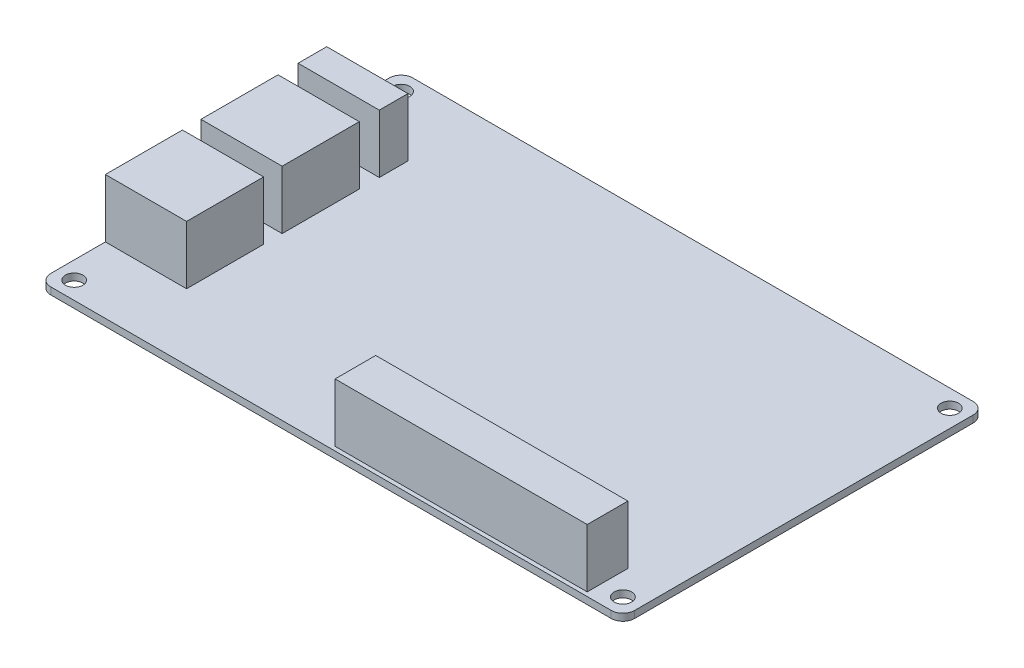
ISO-10303-21;
HEADER;
FILE_DESCRIPTION(('STEP AP214'),'2;1');
FILE_NAME('part.step','',(''),(''),'','','');
FILE_SCHEMA(('AUTOMOTIVE_DESIGN { 1 0 10303 214 1 1 1 1 }'));
ENDSEC;
DATA;
#1=APPLICATION_CONTEXT('core data for automotive mechanical design processes');
#2=APPLICATION_PROTOCOL_DEFINITION('international standard','automotive_design',2000,#1);
#3=PRODUCT_CONTEXT('',#1,'mechanical');
#4=PRODUCT('Part','Part','',(#3));
#5=PRODUCT_RELATED_PRODUCT_CATEGORY('part','',(#4));
#6=PRODUCT_DEFINITION_FORMATION('','',#4);
#7=PRODUCT_DEFINITION_CONTEXT('part definition',#1,'design');
#8=PRODUCT_DEFINITION('design','',#6,#7);
#9=PRODUCT_DEFINITION_SHAPE('','',#8);
#10=(LENGTH_UNIT() NAMED_UNIT(*) SI_UNIT(.MILLI.,.METRE.));
#11=(NAMED_UNIT(*) PLANE_ANGLE_UNIT() SI_UNIT($,.RADIAN.));
#12=(NAMED_UNIT(*) SI_UNIT($,.STERADIAN.) SOLID_ANGLE_UNIT());
#13=UNCERTAINTY_MEASURE_WITH_UNIT(LENGTH_MEASURE(1.E-05),#10,'distance_accuracy_value','');
#14=(GEOMETRIC_REPRESENTATION_CONTEXT(3) GLOBAL_UNCERTAINTY_ASSIGNED_CONTEXT((#13)) GLOBAL_UNIT_ASSIGNED_CONTEXT((#10,
#11,#12)) REPRESENTATION_CONTEXT('',''));
#15=CARTESIAN_POINT('',(0.,0.,0.));
#16=DIRECTION('',(0.,0.,1.));
#17=DIRECTION('',(1.,0.,0.));
#18=AXIS2_PLACEMENT_3D('',#15,#16,#17);
#19=CARTESIAN_POINT('',(-48.,1.2,29.));
#20=DIRECTION('',(0.,-1.,0.));
#21=DIRECTION('',(0.,0.,-1.));
#22=AXIS2_PLACEMENT_3D('',#19,#20,#21);
#23=PLANE('',#22);
#24=DIRECTION('',(1.,0.,0.));
#25=VECTOR('',#24,1.);
#26=CARTESIAN_POINT('',(-50.,1.2,-13.3573164901009));
#27=LINE('',#26,#25);
#28=CARTESIAN_POINT('',(-50.,1.2,-13.3573164901009));
#29=VERTEX_POINT('',#28);
#30=CARTESIAN_POINT('',(-36.0894205408044,1.2,-13.3573164901009));
#31=VERTEX_POINT('',#30);
#32=EDGE_CURVE('E247',#29,#31,#27,.T.);
#33=ORIENTED_EDGE('',*,*,#32,.F.);
#34=DIRECTION('',(0.,0.,1.));
#35=VECTOR('',#34,1.);
#36=CARTESIAN_POINT('',(-50.,1.2,29.));
#37=LINE('',#36,#35);
#38=CARTESIAN_POINT('',(-50.,1.2,-9.92579846845842));
#39=VERTEX_POINT('',#38);
#40=EDGE_CURVE('E362',#29,#39,#37,.T.);
#41=ORIENTED_EDGE('',*,*,#40,.T.);
#42=DIRECTION('',(-1.,0.,0.));
#43=VECTOR('',#42,1.);
#44=CARTESIAN_POINT('',(-50.,1.2,-9.92579846845842));
#45=LINE('',#44,#43);
#46=CARTESIAN_POINT('',(-36.0894205408044,1.2,-9.92579846845842));
#47=VERTEX_POINT('',#46);
#48=EDGE_CURVE('E270',#47,#39,#45,.T.);
#49=ORIENTED_EDGE('',*,*,#48,.F.);
#50=DIRECTION('',(0.,0.,-1.));
#51=VECTOR('',#50,1.);
#52=CARTESIAN_POINT('',(-36.0894205408044,1.2,3.28402507042824));
#53=LINE('',#52,#51);
#54=CARTESIAN_POINT('',(-36.0894205408044,1.2,3.28402507042824));
#55=VERTEX_POINT('',#54);
#56=EDGE_CURVE('E273',#55,#47,#53,.T.);
#57=ORIENTED_EDGE('',*,*,#56,.F.);
#58=DIRECTION('',(1.,0.,0.));
#59=VECTOR('',#58,1.);
#60=CARTESIAN_POINT('',(-50.,1.2,3.28402507042824));
#61=LINE('',#60,#59);
#62=CARTESIAN_POINT('',(-50.,1.2,3.28402507042824));
#63=VERTEX_POINT('',#62);
#64=EDGE_CURVE('E277',#63,#55,#61,.T.);
#65=ORIENTED_EDGE('',*,*,#64,.F.);
#66=CARTESIAN_POINT('',(-50.,1.2,6.45384158542583));
#67=VERTEX_POINT('',#66);
#68=EDGE_CURVE('E828',#63,#67,#37,.T.);
#69=ORIENTED_EDGE('',*,*,#68,.T.);
#70=DIRECTION('',(-1.,0.,0.));
#71=VECTOR('',#70,1.);
#72=CARTESIAN_POINT('',(-50.,1.2,6.45384158542583));
#73=LINE('',#72,#71);
#74=CARTESIAN_POINT('',(-36.0894205408044,1.2,6.45384158542583));
#75=VERTEX_POINT('',#74);
#76=EDGE_CURVE('E292',#75,#67,#73,.T.);
#77=ORIENTED_EDGE('',*,*,#76,.F.);
#78=DIRECTION('',(0.,0.,-1.));
#79=VECTOR('',#78,1.);
#80=CARTESIAN_POINT('',(-36.0894205408044,1.2,19.6554805138192));
#81=LINE('',#80,#79);
#82=CARTESIAN_POINT('',(-36.0894205408044,1.2,19.6554805138192));
#83=VERTEX_POINT('',#82);
#84=EDGE_CURVE('E301',#83,#75,#81,.T.);
#85=ORIENTED_EDGE('',*,*,#84,.F.);
#86=DIRECTION('',(1.,0.,0.));
#87=VECTOR('',#86,1.);
#88=CARTESIAN_POINT('',(-50.,1.2,19.6554805138192));
#89=LINE('',#88,#87);
#90=CARTESIAN_POINT('',(-50.,1.2,19.6554805138192));
#91=VERTEX_POINT('',#90);
#92=EDGE_CURVE('E280',#91,#83,#89,.T.);
#93=ORIENTED_EDGE('',*,*,#92,.F.);
#94=CARTESIAN_POINT('',(-50.,1.2,29.));
#95=VERTEX_POINT('',#94);
#96=EDGE_CURVE('E358',#91,#95,#37,.T.);
#97=ORIENTED_EDGE('',*,*,#96,.T.);
#98=CARTESIAN_POINT('',(-48.,1.2,29.));
#99=DIRECTION('',(0.,1.,0.));
#100=DIRECTION('',(0.,0.,-1.));
#101=AXIS2_PLACEMENT_3D('',#98,#99,#100);
#102=CIRCLE('',#101,2.);
#103=CARTESIAN_POINT('',(-48.,1.2,31.));
#104=VERTEX_POINT('',#103);
#105=EDGE_CURVE('E342',#95,#104,#102,.T.);
#106=ORIENTED_EDGE('',*,*,#105,.T.);
#107=DIRECTION('',(1.,0.,0.));
#108=VECTOR('',#107,1.);
#109=CARTESIAN_POINT('',(48.,1.2,31.));
#110=LINE('',#109,#108);
#111=CARTESIAN_POINT('',(48.,1.2,31.));
#112=VERTEX_POINT('',#111);
#113=EDGE_CURVE('E345',#104,#112,#110,.T.);
#114=ORIENTED_EDGE('',*,*,#113,.T.);
#115=CARTESIAN_POINT('',(48.,1.2,29.));
#116=DIRECTION('',(0.,1.,0.));
#117=DIRECTION('',(0.,0.,1.));
#118=AXIS2_PLACEMENT_3D('',#115,#116,#117);
#119=CIRCLE('',#118,2.);
#120=CARTESIAN_POINT('',(50.,1.2,29.));
#121=VERTEX_POINT('',#120);
#122=EDGE_CURVE('E348',#112,#121,#119,.T.);
#123=ORIENTED_EDGE('',*,*,#122,.T.);
#124=DIRECTION('',(0.,0.,-1.));
#125=VECTOR('',#124,1.);
#126=CARTESIAN_POINT('',(50.,1.2,29.));
#127=LINE('',#126,#125);
#128=CARTESIAN_POINT('',(50.,1.2,-29.));
#129=VERTEX_POINT('',#128);
#130=EDGE_CURVE('E350',#121,#129,#127,.T.);
#131=ORIENTED_EDGE('',*,*,#130,.T.);
#132=CARTESIAN_POINT('',(48.,1.2,-29.));
#133=DIRECTION('',(0.,1.,0.));
#134=DIRECTION('',(0.,0.,1.));
#135=AXIS2_PLACEMENT_3D('',#132,#133,#134);
#136=CIRCLE('',#135,2.);
#137=CARTESIAN_POINT('',(48.,1.2,-31.));
#138=VERTEX_POINT('',#137);
#139=EDGE_CURVE('E352',#129,#138,#136,.T.);
#140=ORIENTED_EDGE('',*,*,#139,.T.);
#141=DIRECTION('',(-1.,0.,0.));
#142=VECTOR('',#141,1.);
#143=CARTESIAN_POINT('',(48.,1.2,-31.));
#144=LINE('',#143,#142);
#145=CARTESIAN_POINT('',(-48.,1.2,-31.));
#146=VERTEX_POINT('',#145);
#147=EDGE_CURVE('E354',#138,#146,#144,.T.);
#148=ORIENTED_EDGE('',*,*,#147,.T.);
#149=CARTESIAN_POINT('',(-48.,1.2,-29.));
#150=DIRECTION('',(0.,1.,0.));
#151=DIRECTION('',(0.,0.,1.));
#152=AXIS2_PLACEMENT_3D('',#149,#150,#151);
#153=CIRCLE('',#152,2.);
#154=CARTESIAN_POINT('',(-50.,1.2,-29.));
#155=VERTEX_POINT('',#154);
#156=EDGE_CURVE('E356',#146,#155,#153,.T.);
#157=ORIENTED_EDGE('',*,*,#156,.T.);
#158=CARTESIAN_POINT('',(-50.,1.2,-18.2632817242734));
#159=VERTEX_POINT('',#158);
#160=EDGE_CURVE('E359',#155,#159,#37,.T.);
#161=ORIENTED_EDGE('',*,*,#160,.T.);
#162=DIRECTION('',(-1.,0.,0.));
#163=VECTOR('',#162,1.);
#164=CARTESIAN_POINT('',(-50.,1.2,-18.2632817242734));
#165=LINE('',#164,#163);
#166=CARTESIAN_POINT('',(-36.0894205408044,1.2,-18.2632817242734));
#167=VERTEX_POINT('',#166);
#168=EDGE_CURVE('E240',#167,#159,#165,.T.);
#169=ORIENTED_EDGE('',*,*,#168,.F.);
#170=DIRECTION('',(0.,0.,-1.));
#171=VECTOR('',#170,1.);
#172=CARTESIAN_POINT('',(-36.0894205408044,1.2,-13.3573164901009));
#173=LINE('',#172,#171);
#174=EDGE_CURVE('E243',#31,#167,#173,.T.);
#175=ORIENTED_EDGE('',*,*,#174,.F.);
#176=EDGE_LOOP('',(#33,#41,#49,#57,#65,#69,#77,#85,#93,#97,#106,#114,#123,#131,#140,#148,#157,
#161,#169,#175));
#177=FACE_BOUND('',#176,.T.);
#178=CARTESIAN_POINT('',(-47.,1.2,-28.));
#179=DIRECTION('',(0.,1.,0.));
#180=DIRECTION('',(0.,0.,1.));
#181=AXIS2_PLACEMENT_3D('',#178,#179,#180);
#182=CIRCLE('',#181,1.5);
#183=CARTESIAN_POINT('',(-47.,1.2,-26.5));
#184=VERTEX_POINT('',#183);
#185=EDGE_CURVE('E336',#184,#184,#182,.T.);
#186=ORIENTED_EDGE('',*,*,#185,.F.);
#187=EDGE_LOOP('',(#186));
#188=FACE_BOUND('',#187,.T.);
#189=CARTESIAN_POINT('',(47.,1.2,-28.));
#190=DIRECTION('',(0.,1.,0.));
#191=DIRECTION('',(0.,0.,1.));
#192=AXIS2_PLACEMENT_3D('',#189,#190,#191);
#193=CIRCLE('',#192,1.5);
#194=CARTESIAN_POINT('',(47.,1.2,-26.5));
#195=VERTEX_POINT('',#194);
#196=EDGE_CURVE('E330',#195,#195,#193,.T.);
#197=ORIENTED_EDGE('',*,*,#196,.F.);
#198=EDGE_LOOP('',(#197));
#199=FACE_BOUND('',#198,.T.);
#200=CARTESIAN_POINT('',(47.,1.2,28.));
#201=DIRECTION('',(0.,1.,0.));
#202=DIRECTION('',(0.,0.,1.));
#203=AXIS2_PLACEMENT_3D('',#200,#201,#202);
#204=CIRCLE('',#203,1.5);
#205=CARTESIAN_POINT('',(47.,1.2,29.5));
#206=VERTEX_POINT('',#205);
#207=EDGE_CURVE('E324',#206,#206,#204,.T.);
#208=ORIENTED_EDGE('',*,*,#207,.F.);
#209=EDGE_LOOP('',(#208));
#210=FACE_BOUND('',#209,.T.);
#211=CARTESIAN_POINT('',(-47.,1.2,28.));
#212=DIRECTION('',(0.,1.,0.));
#213=DIRECTION('',(0.,0.,1.));
#214=AXIS2_PLACEMENT_3D('',#211,#212,#213);
#215=CIRCLE('',#214,1.5);
#216=CARTESIAN_POINT('',(-47.,1.2,29.5));
#217=VERTEX_POINT('',#216);
#218=EDGE_CURVE('E318',#217,#217,#215,.T.);
#219=ORIENTED_EDGE('',*,*,#218,.F.);
#220=EDGE_LOOP('',(#219));
#221=FACE_BOUND('',#220,.T.);
#222=DIRECTION('',(0.,0.,1.));
#223=VECTOR('',#222,1.);
#224=CARTESIAN_POINT('',(0.,1.2,30.3055639018339));
#225=LINE('',#224,#223);
#226=CARTESIAN_POINT('',(0.,1.2,23.3433574289847));
#227=VERTEX_POINT('',#226);
#228=CARTESIAN_POINT('',(0.,1.2,30.3055639018339));
#229=VERTEX_POINT('',#228);
#230=EDGE_CURVE('E221',#227,#229,#225,.T.);
#231=ORIENTED_EDGE('',*,*,#230,.F.);
#232=DIRECTION('',(-1.,0.,0.));
#233=VECTOR('',#232,1.);
#234=CARTESIAN_POINT('',(0.,1.2,23.3433574289847));
#235=LINE('',#234,#233);
#236=CARTESIAN_POINT('',(43.1937900831052,1.2,23.3433574289847));
#237=VERTEX_POINT('',#236);
#238=EDGE_CURVE('E218',#237,#227,#235,.T.);
#239=ORIENTED_EDGE('',*,*,#238,.F.);
#240=DIRECTION('',(0.,0.,-1.));
#241=VECTOR('',#240,1.);
#242=CARTESIAN_POINT('',(43.1937900831052,1.2,30.3055639018339));
#243=LINE('',#242,#241);
#244=CARTESIAN_POINT('',(43.1937900831052,1.2,30.3055639018339));
#245=VERTEX_POINT('',#244);
#246=EDGE_CURVE('E60',#245,#237,#243,.T.);
#247=ORIENTED_EDGE('',*,*,#246,.F.);
#248=DIRECTION('',(1.,0.,0.));
#249=VECTOR('',#248,1.);
#250=CARTESIAN_POINT('',(0.,1.2,30.3055639018339));
#251=LINE('',#250,#249);
#252=EDGE_CURVE('E55',#229,#245,#251,.T.);
#253=ORIENTED_EDGE('',*,*,#252,.F.);
#254=EDGE_LOOP('',(#231,#239,#247,#253));
#255=FACE_BOUND('',#254,.T.);
#256=ADVANCED_FACE('F40',(#177,#188,#199,#210,#221,#255),#23,.F.);
#257=CARTESIAN_POINT('',(-48.,0.,29.));
#258=DIRECTION('',(0.,-1.,0.));
#259=DIRECTION('',(0.,0.,-1.));
#260=AXIS2_PLACEMENT_3D('',#257,#258,#259);
#261=PLANE('',#260);
#262=CARTESIAN_POINT('',(47.,0.,28.));
#263=DIRECTION('',(0.,1.,0.));
#264=DIRECTION('',(0.,0.,1.));
#265=AXIS2_PLACEMENT_3D('',#262,#263,#264);
#266=CIRCLE('',#265,1.5);
#267=CARTESIAN_POINT('',(47.,0.,29.5));
#268=VERTEX_POINT('',#267);
#269=EDGE_CURVE('E321',#268,#268,#266,.T.);
#270=ORIENTED_EDGE('',*,*,#269,.T.);
#271=EDGE_LOOP('',(#270));
#272=FACE_BOUND('',#271,.T.);
#273=CARTESIAN_POINT('',(-47.,0.,-28.));
#274=DIRECTION('',(0.,1.,0.));
#275=DIRECTION('',(0.,0.,1.));
#276=AXIS2_PLACEMENT_3D('',#273,#274,#275);
#277=CIRCLE('',#276,1.5);
#278=CARTESIAN_POINT('',(-47.,0.,-26.5));
#279=VERTEX_POINT('',#278);
#280=EDGE_CURVE('E333',#279,#279,#277,.T.);
#281=ORIENTED_EDGE('',*,*,#280,.T.);
#282=EDGE_LOOP('',(#281));
#283=FACE_BOUND('',#282,.T.);
#284=CARTESIAN_POINT('',(-48.,0.,29.));
#285=DIRECTION('',(0.,1.,0.));
#286=DIRECTION('',(0.,0.,-1.));
#287=AXIS2_PLACEMENT_3D('',#284,#285,#286);
#288=CIRCLE('',#287,2.);
#289=CARTESIAN_POINT('',(-50.,0.,29.));
#290=VERTEX_POINT('',#289);
#291=CARTESIAN_POINT('',(-48.,0.,31.));
#292=VERTEX_POINT('',#291);
#293=EDGE_CURVE('E339',#290,#292,#288,.T.);
#294=ORIENTED_EDGE('',*,*,#293,.F.);
#295=DIRECTION('',(0.,0.,1.));
#296=VECTOR('',#295,1.);
#297=CARTESIAN_POINT('',(-50.,0.,29.));
#298=LINE('',#297,#296);
#299=CARTESIAN_POINT('',(-50.,0.,-29.));
#300=VERTEX_POINT('',#299);
#301=EDGE_CURVE('E346',#300,#290,#298,.T.);
#302=ORIENTED_EDGE('',*,*,#301,.F.);
#303=CARTESIAN_POINT('',(-48.,0.,-29.));
#304=DIRECTION('',(0.,1.,0.));
#305=DIRECTION('',(0.,0.,1.));
#306=AXIS2_PLACEMENT_3D('',#303,#304,#305);
#307=CIRCLE('',#306,2.);
#308=CARTESIAN_POINT('',(-48.,0.,-31.));
#309=VERTEX_POINT('',#308);
#310=EDGE_CURVE('E375',#309,#300,#307,.T.);
#311=ORIENTED_EDGE('',*,*,#310,.F.);
#312=DIRECTION('',(-1.,0.,0.));
#313=VECTOR('',#312,1.);
#314=CARTESIAN_POINT('',(48.,0.,-31.));
#315=LINE('',#314,#313);
#316=CARTESIAN_POINT('',(48.,0.,-31.));
#317=VERTEX_POINT('',#316);
#318=EDGE_CURVE('E373',#317,#309,#315,.T.);
#319=ORIENTED_EDGE('',*,*,#318,.F.);
#320=CARTESIAN_POINT('',(48.,0.,-29.));
#321=DIRECTION('',(0.,1.,0.));
#322=DIRECTION('',(0.,0.,1.));
#323=AXIS2_PLACEMENT_3D('',#320,#321,#322);
#324=CIRCLE('',#323,2.);
#325=CARTESIAN_POINT('',(50.,0.,-29.));
#326=VERTEX_POINT('',#325);
#327=EDGE_CURVE('E371',#326,#317,#324,.T.);
#328=ORIENTED_EDGE('',*,*,#327,.F.);
#329=DIRECTION('',(0.,0.,-1.));
#330=VECTOR('',#329,1.);
#331=CARTESIAN_POINT('',(50.,0.,29.));
#332=LINE('',#331,#330);
#333=CARTESIAN_POINT('',(50.,0.,29.));
#334=VERTEX_POINT('',#333);
#335=EDGE_CURVE('E369',#334,#326,#332,.T.);
#336=ORIENTED_EDGE('',*,*,#335,.F.);
#337=CARTESIAN_POINT('',(48.,0.,29.));
#338=DIRECTION('',(0.,1.,0.));
#339=DIRECTION('',(0.,0.,1.));
#340=AXIS2_PLACEMENT_3D('',#337,#338,#339);
#341=CIRCLE('',#340,2.);
#342=CARTESIAN_POINT('',(48.,0.,31.));
#343=VERTEX_POINT('',#342);
#344=EDGE_CURVE('E367',#343,#334,#341,.T.);
#345=ORIENTED_EDGE('',*,*,#344,.F.);
#346=DIRECTION('',(1.,0.,0.));
#347=VECTOR('',#346,1.);
#348=CARTESIAN_POINT('',(48.,0.,31.));
#349=LINE('',#348,#347);
#350=EDGE_CURVE('E365',#292,#343,#349,.T.);
#351=ORIENTED_EDGE('',*,*,#350,.F.);
#352=EDGE_LOOP('',(#294,#302,#311,#319,#328,#336,#345,#351));
#353=FACE_BOUND('',#352,.T.);
#354=CARTESIAN_POINT('',(47.,0.,-28.));
#355=DIRECTION('',(0.,1.,0.));
#356=DIRECTION('',(0.,0.,1.));
#357=AXIS2_PLACEMENT_3D('',#354,#355,#356);
#358=CIRCLE('',#357,1.5);
#359=CARTESIAN_POINT('',(47.,0.,-26.5));
#360=VERTEX_POINT('',#359);
#361=EDGE_CURVE('E327',#360,#360,#358,.T.);
#362=ORIENTED_EDGE('',*,*,#361,.T.);
#363=EDGE_LOOP('',(#362));
#364=FACE_BOUND('',#363,.T.);
#365=CARTESIAN_POINT('',(-47.,0.,28.));
#366=DIRECTION('',(0.,1.,0.));
#367=DIRECTION('',(0.,0.,1.));
#368=AXIS2_PLACEMENT_3D('',#365,#366,#367);
#369=CIRCLE('',#368,1.5);
#370=CARTESIAN_POINT('',(-47.,0.,29.5));
#371=VERTEX_POINT('',#370);
#372=EDGE_CURVE('E317',#371,#371,#369,.T.);
#373=ORIENTED_EDGE('',*,*,#372,.T.);
#374=EDGE_LOOP('',(#373));
#375=FACE_BOUND('',#374,.T.);
#376=ADVANCED_FACE('F405',(#272,#283,#353,#364,#375),#261,.T.);
#377=CARTESIAN_POINT('',(-48.,1.2,29.));
#378=DIRECTION('',(0.,-1.,0.));
#379=DIRECTION('',(0.,0.,-1.));
#380=AXIS2_PLACEMENT_3D('',#377,#378,#379);
#381=CYLINDRICAL_SURFACE('',#380,2.);
#382=ORIENTED_EDGE('',*,*,#293,.T.);
#383=DIRECTION('',(0.,-1.,0.));
#384=VECTOR('',#383,1.);
#385=CARTESIAN_POINT('',(-48.,1.2,31.));
#386=LINE('',#385,#384);
#387=EDGE_CURVE('E11',#104,#292,#386,.T.);
#388=ORIENTED_EDGE('',*,*,#387,.F.);
#389=ORIENTED_EDGE('',*,*,#105,.F.);
#390=DIRECTION('',(0.,-1.,0.));
#391=VECTOR('',#390,1.);
#392=CARTESIAN_POINT('',(-50.,1.2,29.));
#393=LINE('',#392,#391);
#394=EDGE_CURVE('E361',#95,#290,#393,.T.);
#395=ORIENTED_EDGE('',*,*,#394,.T.);
#396=EDGE_LOOP('',(#382,#388,#389,#395));
#397=FACE_BOUND('',#396,.T.);
#398=ADVANCED_FACE('F42',(#397),#381,.T.);
#399=CARTESIAN_POINT('',(48.,1.2,31.));
#400=DIRECTION('',(0.,0.,-1.));
#401=DIRECTION('',(-1.,0.,0.));
#402=AXIS2_PLACEMENT_3D('',#399,#400,#401);
#403=PLANE('',#402);
#404=ORIENTED_EDGE('',*,*,#350,.T.);
#405=DIRECTION('',(0.,-1.,0.));
#406=VECTOR('',#405,1.);
#407=CARTESIAN_POINT('',(48.,1.2,31.));
#408=LINE('',#407,#406);
#409=EDGE_CURVE('E48',#112,#343,#408,.T.);
#410=ORIENTED_EDGE('',*,*,#409,.F.);
#411=ORIENTED_EDGE('',*,*,#113,.F.);
#412=ORIENTED_EDGE('',*,*,#387,.T.);
#413=EDGE_LOOP('',(#404,#410,#411,#412));
#414=FACE_BOUND('',#413,.T.);
#415=ADVANCED_FACE('F424',(#414),#403,.F.);
#416=CARTESIAN_POINT('',(48.,1.2,29.));
#417=DIRECTION('',(0.,-1.,0.));
#418=DIRECTION('',(0.,0.,-1.));
#419=AXIS2_PLACEMENT_3D('',#416,#417,#418);
#420=CYLINDRICAL_SURFACE('',#419,2.);
#421=ORIENTED_EDGE('',*,*,#344,.T.);
#422=DIRECTION('',(0.,-1.,0.));
#423=VECTOR('',#422,1.);
#424=CARTESIAN_POINT('',(50.,1.2,29.));
#425=LINE('',#424,#423);
#426=EDGE_CURVE('E392',#121,#334,#425,.T.);
#427=ORIENTED_EDGE('',*,*,#426,.F.);
#428=ORIENTED_EDGE('',*,*,#122,.F.);
#429=ORIENTED_EDGE('',*,*,#409,.T.);
#430=EDGE_LOOP('',(#421,#427,#428,#429));
#431=FACE_BOUND('',#430,.T.);
#432=ADVANCED_FACE('F399',(#431),#420,.T.);
#433=CARTESIAN_POINT('',(50.,1.2,29.));
#434=DIRECTION('',(-1.,0.,0.));
#435=DIRECTION('',(0.,0.,1.));
#436=AXIS2_PLACEMENT_3D('',#433,#434,#435);
#437=PLANE('',#436);
#438=ORIENTED_EDGE('',*,*,#335,.T.);
#439=DIRECTION('',(0.,-1.,0.));
#440=VECTOR('',#439,1.);
#441=CARTESIAN_POINT('',(50.,1.2,-29.));
#442=LINE('',#441,#440);
#443=EDGE_CURVE('E389',#129,#326,#442,.T.);
#444=ORIENTED_EDGE('',*,*,#443,.F.);
#445=ORIENTED_EDGE('',*,*,#130,.F.);
#446=ORIENTED_EDGE('',*,*,#426,.T.);
#447=EDGE_LOOP('',(#438,#444,#445,#446));
#448=FACE_BOUND('',#447,.T.);
#449=ADVANCED_FACE('F411',(#448),#437,.F.);
#450=CARTESIAN_POINT('',(48.,1.2,-29.));
#451=DIRECTION('',(0.,-1.,0.));
#452=DIRECTION('',(0.,0.,-1.));
#453=AXIS2_PLACEMENT_3D('',#450,#451,#452);
#454=CYLINDRICAL_SURFACE('',#453,2.);
#455=ORIENTED_EDGE('',*,*,#327,.T.);
#456=DIRECTION('',(0.,-1.,0.));
#457=VECTOR('',#456,1.);
#458=CARTESIAN_POINT('',(48.,1.2,-31.));
#459=LINE('',#458,#457);
#460=EDGE_CURVE('E386',#138,#317,#459,.T.);
#461=ORIENTED_EDGE('',*,*,#460,.F.);
#462=ORIENTED_EDGE('',*,*,#139,.F.);
#463=ORIENTED_EDGE('',*,*,#443,.T.);
#464=EDGE_LOOP('',(#455,#461,#462,#463));
#465=FACE_BOUND('',#464,.T.);
#466=ADVANCED_FACE('F415',(#465),#454,.T.);
#467=CARTESIAN_POINT('',(48.,1.2,-31.));
#468=DIRECTION('',(0.,0.,1.));
#469=DIRECTION('',(1.,0.,0.));
#470=AXIS2_PLACEMENT_3D('',#467,#468,#469);
#471=PLANE('',#470);
#472=ORIENTED_EDGE('',*,*,#318,.T.);
#473=DIRECTION('',(0.,-1.,0.));
#474=VECTOR('',#473,1.);
#475=CARTESIAN_POINT('',(-48.,1.2,-31.));
#476=LINE('',#475,#474);
#477=EDGE_CURVE('E383',#146,#309,#476,.T.);
#478=ORIENTED_EDGE('',*,*,#477,.F.);
#479=ORIENTED_EDGE('',*,*,#147,.F.);
#480=ORIENTED_EDGE('',*,*,#460,.T.);
#481=EDGE_LOOP('',(#472,#478,#479,#480));
#482=FACE_BOUND('',#481,.T.);
#483=ADVANCED_FACE('F438',(#482),#471,.F.);
#484=CARTESIAN_POINT('',(-48.,1.2,-29.));
#485=DIRECTION('',(0.,-1.,0.));
#486=DIRECTION('',(0.,0.,-1.));
#487=AXIS2_PLACEMENT_3D('',#484,#485,#486);
#488=CYLINDRICAL_SURFACE('',#487,2.);
#489=ORIENTED_EDGE('',*,*,#310,.T.);
#490=DIRECTION('',(0.,-1.,0.));
#491=VECTOR('',#490,1.);
#492=CARTESIAN_POINT('',(-50.,1.2,-29.));
#493=LINE('',#492,#491);
#494=EDGE_CURVE('E380',#155,#300,#493,.T.);
#495=ORIENTED_EDGE('',*,*,#494,.F.);
#496=ORIENTED_EDGE('',*,*,#156,.F.);
#497=ORIENTED_EDGE('',*,*,#477,.T.);
#498=EDGE_LOOP('',(#489,#495,#496,#497));
#499=FACE_BOUND('',#498,.T.);
#500=ADVANCED_FACE('F436',(#499),#488,.T.);
#501=CARTESIAN_POINT('',(-50.,1.2,29.));
#502=DIRECTION('',(1.,0.,0.));
#503=DIRECTION('',(0.,0.,-1.));
#504=AXIS2_PLACEMENT_3D('',#501,#502,#503);
#505=PLANE('',#504);
#506=ORIENTED_EDGE('',*,*,#301,.T.);
#507=ORIENTED_EDGE('',*,*,#394,.F.);
#508=ORIENTED_EDGE('',*,*,#96,.F.);
#509=DIRECTION('',(0.,-1.,0.));
#510=VECTOR('',#509,1.);
#511=CARTESIAN_POINT('',(-50.,11.2,19.6554805138192));
#512=LINE('',#511,#510);
#513=CARTESIAN_POINT('',(-50.,11.2,19.6554805138192));
#514=VERTEX_POINT('',#513);
#515=EDGE_CURVE('E314',#514,#91,#512,.T.);
#516=ORIENTED_EDGE('',*,*,#515,.F.);
#517=DIRECTION('',(0.,0.,1.));
#518=VECTOR('',#517,1.);
#519=CARTESIAN_POINT('',(-50.,11.2,19.6554805138192));
#520=LINE('',#519,#518);
#521=CARTESIAN_POINT('',(-50.,11.2,6.45384158542583));
#522=VERTEX_POINT('',#521);
#523=EDGE_CURVE('E288',#522,#514,#520,.T.);
#524=ORIENTED_EDGE('',*,*,#523,.F.);
#525=DIRECTION('',(0.,-1.,0.));
#526=VECTOR('',#525,1.);
#527=CARTESIAN_POINT('',(-50.,11.2,6.45384158542583));
#528=LINE('',#527,#526);
#529=EDGE_CURVE('E298',#522,#67,#528,.T.);
#530=ORIENTED_EDGE('',*,*,#529,.T.);
#531=ORIENTED_EDGE('',*,*,#68,.F.);
#532=DIRECTION('',(0.,-1.,0.));
#533=VECTOR('',#532,1.);
#534=CARTESIAN_POINT('',(-50.,11.2,3.28402507042824));
#535=LINE('',#534,#533);
#536=CARTESIAN_POINT('',(-50.,11.2,3.28402507042824));
#537=VERTEX_POINT('',#536);
#538=EDGE_CURVE('E250',#537,#63,#535,.T.);
#539=ORIENTED_EDGE('',*,*,#538,.F.);
#540=DIRECTION('',(0.,0.,1.));
#541=VECTOR('',#540,1.);
#542=CARTESIAN_POINT('',(-50.,11.2,3.28402507042824));
#543=LINE('',#542,#541);
#544=CARTESIAN_POINT('',(-50.,11.2,-9.92579846845842));
#545=VERTEX_POINT('',#544);
#546=EDGE_CURVE('E274',#545,#537,#543,.T.);
#547=ORIENTED_EDGE('',*,*,#546,.F.);
#548=DIRECTION('',(0.,-1.,0.));
#549=VECTOR('',#548,1.);
#550=CARTESIAN_POINT('',(-50.,11.2,-9.92579846845842));
#551=LINE('',#550,#549);
#552=EDGE_CURVE('E266',#545,#39,#551,.T.);
#553=ORIENTED_EDGE('',*,*,#552,.T.);
#554=ORIENTED_EDGE('',*,*,#40,.F.);
#555=DIRECTION('',(0.,-1.,0.));
#556=VECTOR('',#555,1.);
#557=CARTESIAN_POINT('',(-50.,11.2,-13.3573164901009));
#558=LINE('',#557,#556);
#559=CARTESIAN_POINT('',(-50.,11.2,-13.3573164901009));
#560=VERTEX_POINT('',#559);
#561=EDGE_CURVE('E222',#560,#29,#558,.T.);
#562=ORIENTED_EDGE('',*,*,#561,.F.);
#563=DIRECTION('',(0.,0.,1.));
#564=VECTOR('',#563,1.);
#565=CARTESIAN_POINT('',(-50.,11.2,-13.3573164901009));
#566=LINE('',#565,#564);
#567=CARTESIAN_POINT('',(-50.,11.2,-18.2632817242734));
#568=VERTEX_POINT('',#567);
#569=EDGE_CURVE('E244',#568,#560,#566,.T.);
#570=ORIENTED_EDGE('',*,*,#569,.F.);
#571=DIRECTION('',(0.,-1.,0.));
#572=VECTOR('',#571,1.);
#573=CARTESIAN_POINT('',(-50.,11.2,-18.2632817242734));
#574=LINE('',#573,#572);
#575=EDGE_CURVE('E236',#568,#159,#574,.T.);
#576=ORIENTED_EDGE('',*,*,#575,.T.);
#577=ORIENTED_EDGE('',*,*,#160,.F.);
#578=ORIENTED_EDGE('',*,*,#494,.T.);
#579=EDGE_LOOP('',(#506,#507,#508,#516,#524,#530,#531,#539,#547,#553,#554,#562,#570,#576,#577,#578));
#580=FACE_BOUND('',#579,.T.);
#581=ADVANCED_FACE('F430',(#580),#505,.F.);
#582=CARTESIAN_POINT('',(-47.,1.2,-28.));
#583=DIRECTION('',(0.,-1.,0.));
#584=DIRECTION('',(0.,0.,-1.));
#585=AXIS2_PLACEMENT_3D('',#582,#583,#584);
#586=CYLINDRICAL_SURFACE('',#585,1.5);
#587=ORIENTED_EDGE('',*,*,#185,.T.);
#588=EDGE_LOOP('',(#587));
#589=FACE_BOUND('',#588,.T.);
#590=ORIENTED_EDGE('',*,*,#280,.F.);
#591=EDGE_LOOP('',(#590));
#592=FACE_BOUND('',#591,.T.);
#593=ADVANCED_FACE('F455',(#589,#592),#586,.F.);
#594=CARTESIAN_POINT('',(47.,1.2,-28.));
#595=DIRECTION('',(0.,-1.,0.));
#596=DIRECTION('',(0.,0.,-1.));
#597=AXIS2_PLACEMENT_3D('',#594,#595,#596);
#598=CYLINDRICAL_SURFACE('',#597,1.5);
#599=ORIENTED_EDGE('',*,*,#196,.T.);
#600=EDGE_LOOP('',(#599));
#601=FACE_BOUND('',#600,.T.);
#602=ORIENTED_EDGE('',*,*,#361,.F.);
#603=EDGE_LOOP('',(#602));
#604=FACE_BOUND('',#603,.T.);
#605=ADVANCED_FACE('F462',(#601,#604),#598,.F.);
#606=CARTESIAN_POINT('',(47.,1.2,28.));
#607=DIRECTION('',(0.,-1.,0.));
#608=DIRECTION('',(0.,0.,-1.));
#609=AXIS2_PLACEMENT_3D('',#606,#607,#608);
#610=CYLINDRICAL_SURFACE('',#609,1.5);
#611=ORIENTED_EDGE('',*,*,#207,.T.);
#612=EDGE_LOOP('',(#611));
#613=FACE_BOUND('',#612,.T.);
#614=ORIENTED_EDGE('',*,*,#269,.F.);
#615=EDGE_LOOP('',(#614));
#616=FACE_BOUND('',#615,.T.);
#617=ADVANCED_FACE('F467',(#613,#616),#610,.F.);
#618=CARTESIAN_POINT('',(-47.,1.2,28.));
#619=DIRECTION('',(0.,-1.,0.));
#620=DIRECTION('',(0.,0.,-1.));
#621=AXIS2_PLACEMENT_3D('',#618,#619,#620);
#622=CYLINDRICAL_SURFACE('',#621,1.5);
#623=ORIENTED_EDGE('',*,*,#218,.T.);
#624=EDGE_LOOP('',(#623));
#625=FACE_BOUND('',#624,.T.);
#626=ORIENTED_EDGE('',*,*,#372,.F.);
#627=EDGE_LOOP('',(#626));
#628=FACE_BOUND('',#627,.T.);
#629=ADVANCED_FACE('F553',(#625,#628),#622,.F.);
#630=CARTESIAN_POINT('',(-50.,11.2,19.6554805138192));
#631=DIRECTION('',(0.,0.,-1.));
#632=DIRECTION('',(-1.,0.,0.));
#633=AXIS2_PLACEMENT_3D('',#630,#631,#632);
#634=PLANE('',#633);
#635=ORIENTED_EDGE('',*,*,#92,.T.);
#636=DIRECTION('',(0.,-1.,0.));
#637=VECTOR('',#636,1.);
#638=CARTESIAN_POINT('',(-36.0894205408044,11.2,19.6554805138192));
#639=LINE('',#638,#637);
#640=CARTESIAN_POINT('',(-36.0894205408044,11.2,19.6554805138192));
#641=VERTEX_POINT('',#640);
#642=EDGE_CURVE('E311',#641,#83,#639,.T.);
#643=ORIENTED_EDGE('',*,*,#642,.F.);
#644=DIRECTION('',(1.,0.,0.));
#645=VECTOR('',#644,1.);
#646=CARTESIAN_POINT('',(-50.,11.2,19.6554805138192));
#647=LINE('',#646,#645);
#648=EDGE_CURVE('E291',#514,#641,#647,.T.);
#649=ORIENTED_EDGE('',*,*,#648,.F.);
#650=ORIENTED_EDGE('',*,*,#515,.T.);
#651=EDGE_LOOP('',(#635,#643,#649,#650));
#652=FACE_BOUND('',#651,.T.);
#653=ADVANCED_FACE('F549',(#652),#634,.F.);
#654=CARTESIAN_POINT('',(-36.0894205408044,11.2,19.6554805138192));
#655=DIRECTION('',(-1.,0.,0.));
#656=DIRECTION('',(0.,0.,1.));
#657=AXIS2_PLACEMENT_3D('',#654,#655,#656);
#658=PLANE('',#657);
#659=ORIENTED_EDGE('',*,*,#84,.T.);
#660=DIRECTION('',(0.,-1.,0.));
#661=VECTOR('',#660,1.);
#662=CARTESIAN_POINT('',(-36.0894205408044,11.2,6.45384158542583));
#663=LINE('',#662,#661);
#664=CARTESIAN_POINT('',(-36.0894205408044,11.2,6.45384158542583));
#665=VERTEX_POINT('',#664);
#666=EDGE_CURVE('E308',#665,#75,#663,.T.);
#667=ORIENTED_EDGE('',*,*,#666,.F.);
#668=DIRECTION('',(0.,0.,-1.));
#669=VECTOR('',#668,1.);
#670=CARTESIAN_POINT('',(-36.0894205408044,11.2,19.6554805138192));
#671=LINE('',#670,#669);
#672=EDGE_CURVE('E294',#641,#665,#671,.T.);
#673=ORIENTED_EDGE('',*,*,#672,.F.);
#674=ORIENTED_EDGE('',*,*,#642,.T.);
#675=EDGE_LOOP('',(#659,#667,#673,#674));
#676=FACE_BOUND('',#675,.T.);
#677=ADVANCED_FACE('F545',(#676),#658,.F.);
#678=CARTESIAN_POINT('',(-50.,11.2,6.45384158542583));
#679=DIRECTION('',(0.,0.,1.));
#680=DIRECTION('',(1.,0.,0.));
#681=AXIS2_PLACEMENT_3D('',#678,#679,#680);
#682=PLANE('',#681);
#683=ORIENTED_EDGE('',*,*,#76,.T.);
#684=ORIENTED_EDGE('',*,*,#529,.F.);
#685=DIRECTION('',(-1.,0.,0.));
#686=VECTOR('',#685,1.);
#687=CARTESIAN_POINT('',(-50.,11.2,6.45384158542583));
#688=LINE('',#687,#686);
#689=EDGE_CURVE('E296',#665,#522,#688,.T.);
#690=ORIENTED_EDGE('',*,*,#689,.F.);
#691=ORIENTED_EDGE('',*,*,#666,.T.);
#692=EDGE_LOOP('',(#683,#684,#690,#691));
#693=FACE_BOUND('',#692,.T.);
#694=ADVANCED_FACE('F541',(#693),#682,.F.);
#695=CARTESIAN_POINT('',(0.,11.2,0.));
#696=DIRECTION('',(0.,-1.,0.));
#697=DIRECTION('',(0.,0.,-1.));
#698=AXIS2_PLACEMENT_3D('',#695,#696,#697);
#699=PLANE('',#698);
#700=ORIENTED_EDGE('',*,*,#523,.T.);
#701=ORIENTED_EDGE('',*,*,#648,.T.);
#702=ORIENTED_EDGE('',*,*,#672,.T.);
#703=ORIENTED_EDGE('',*,*,#689,.T.);
#704=EDGE_LOOP('',(#700,#701,#702,#703));
#705=FACE_BOUND('',#704,.T.);
#706=ADVANCED_FACE('F527',(#705),#699,.F.);
#707=CARTESIAN_POINT('',(-50.,11.2,3.28402507042824));
#708=DIRECTION('',(0.,0.,-1.));
#709=DIRECTION('',(-1.,0.,0.));
#710=AXIS2_PLACEMENT_3D('',#707,#708,#709);
#711=PLANE('',#710);
#712=ORIENTED_EDGE('',*,*,#64,.T.);
#713=DIRECTION('',(0.,-1.,0.));
#714=VECTOR('',#713,1.);
#715=CARTESIAN_POINT('',(-36.0894205408044,11.2,3.28402507042824));
#716=LINE('',#715,#714);
#717=CARTESIAN_POINT('',(-36.0894205408044,11.2,3.28402507042824));
#718=VERTEX_POINT('',#717);
#719=EDGE_CURVE('E260',#718,#55,#716,.T.);
#720=ORIENTED_EDGE('',*,*,#719,.F.);
#721=DIRECTION('',(1.,0.,0.));
#722=VECTOR('',#721,1.);
#723=CARTESIAN_POINT('',(-50.,11.2,3.28402507042824));
#724=LINE('',#723,#722);
#725=EDGE_CURVE('E284',#537,#718,#724,.T.);
#726=ORIENTED_EDGE('',*,*,#725,.F.);
#727=ORIENTED_EDGE('',*,*,#538,.T.);
#728=EDGE_LOOP('',(#712,#720,#726,#727));
#729=FACE_BOUND('',#728,.T.);
#730=ADVANCED_FACE('F523',(#729),#711,.F.);
#731=CARTESIAN_POINT('',(-36.0894205408044,11.2,3.28402507042824));
#732=DIRECTION('',(-1.,0.,0.));
#733=DIRECTION('',(0.,0.,1.));
#734=AXIS2_PLACEMENT_3D('',#731,#732,#733);
#735=PLANE('',#734);
#736=ORIENTED_EDGE('',*,*,#56,.T.);
#737=DIRECTION('',(0.,-1.,0.));
#738=VECTOR('',#737,1.);
#739=CARTESIAN_POINT('',(-36.0894205408044,11.2,-9.92579846845842));
#740=LINE('',#739,#738);
#741=CARTESIAN_POINT('',(-36.0894205408044,11.2,-9.92579846845842));
#742=VERTEX_POINT('',#741);
#743=EDGE_CURVE('E263',#742,#47,#740,.T.);
#744=ORIENTED_EDGE('',*,*,#743,.F.);
#745=DIRECTION('',(0.,0.,-1.));
#746=VECTOR('',#745,1.);
#747=CARTESIAN_POINT('',(-36.0894205408044,11.2,3.28402507042824));
#748=LINE('',#747,#746);
#749=EDGE_CURVE('E282',#718,#742,#748,.T.);
#750=ORIENTED_EDGE('',*,*,#749,.F.);
#751=ORIENTED_EDGE('',*,*,#719,.T.);
#752=EDGE_LOOP('',(#736,#744,#750,#751));
#753=FACE_BOUND('',#752,.T.);
#754=ADVANCED_FACE('F526',(#753),#735,.F.);
#755=CARTESIAN_POINT('',(-50.,11.2,-9.92579846845842));
#756=DIRECTION('',(0.,0.,1.));
#757=DIRECTION('',(1.,0.,0.));
#758=AXIS2_PLACEMENT_3D('',#755,#756,#757);
#759=PLANE('',#758);
#760=ORIENTED_EDGE('',*,*,#48,.T.);
#761=ORIENTED_EDGE('',*,*,#552,.F.);
#762=DIRECTION('',(-1.,0.,0.));
#763=VECTOR('',#762,1.);
#764=CARTESIAN_POINT('',(-50.,11.2,-9.92579846845842));
#765=LINE('',#764,#763);
#766=EDGE_CURVE('E269',#742,#545,#765,.T.);
#767=ORIENTED_EDGE('',*,*,#766,.F.);
#768=ORIENTED_EDGE('',*,*,#743,.T.);
#769=EDGE_LOOP('',(#760,#761,#767,#768));
#770=FACE_BOUND('',#769,.T.);
#771=ADVANCED_FACE('F531',(#770),#759,.F.);
#772=CARTESIAN_POINT('',(0.,11.2,0.));
#773=DIRECTION('',(0.,-1.,0.));
#774=DIRECTION('',(0.,0.,-1.));
#775=AXIS2_PLACEMENT_3D('',#772,#773,#774);
#776=PLANE('',#775);
#777=ORIENTED_EDGE('',*,*,#546,.T.);
#778=ORIENTED_EDGE('',*,*,#725,.T.);
#779=ORIENTED_EDGE('',*,*,#749,.T.);
#780=ORIENTED_EDGE('',*,*,#766,.T.);
#781=EDGE_LOOP('',(#777,#778,#779,#780));
#782=FACE_BOUND('',#781,.T.);
#783=ADVANCED_FACE('F511',(#782),#776,.F.);
#784=CARTESIAN_POINT('',(-50.,11.2,-13.3573164901009));
#785=DIRECTION('',(0.,0.,-1.));
#786=DIRECTION('',(-1.,0.,0.));
#787=AXIS2_PLACEMENT_3D('',#784,#785,#786);
#788=PLANE('',#787);
#789=ORIENTED_EDGE('',*,*,#32,.T.);
#790=DIRECTION('',(0.,-1.,0.));
#791=VECTOR('',#790,1.);
#792=CARTESIAN_POINT('',(-36.0894205408044,11.2,-13.3573164901009));
#793=LINE('',#792,#791);
#794=CARTESIAN_POINT('',(-36.0894205408044,11.2,-13.3573164901009));
#795=VERTEX_POINT('',#794);
#796=EDGE_CURVE('E225',#795,#31,#793,.T.);
#797=ORIENTED_EDGE('',*,*,#796,.F.);
#798=DIRECTION('',(1.,0.,0.));
#799=VECTOR('',#798,1.);
#800=CARTESIAN_POINT('',(-50.,11.2,-13.3573164901009));
#801=LINE('',#800,#799);
#802=EDGE_CURVE('E254',#560,#795,#801,.T.);
#803=ORIENTED_EDGE('',*,*,#802,.F.);
#804=ORIENTED_EDGE('',*,*,#561,.T.);
#805=EDGE_LOOP('',(#789,#797,#803,#804));
#806=FACE_BOUND('',#805,.T.);
#807=ADVANCED_FACE('F507',(#806),#788,.F.);
#808=CARTESIAN_POINT('',(-36.0894205408044,11.2,-13.3573164901009));
#809=DIRECTION('',(-1.,0.,0.));
#810=DIRECTION('',(0.,0.,1.));
#811=AXIS2_PLACEMENT_3D('',#808,#809,#810);
#812=PLANE('',#811);
#813=ORIENTED_EDGE('',*,*,#174,.T.);
#814=DIRECTION('',(0.,-1.,0.));
#815=VECTOR('',#814,1.);
#816=CARTESIAN_POINT('',(-36.0894205408044,11.2,-18.2632817242734));
#817=LINE('',#816,#815);
#818=CARTESIAN_POINT('',(-36.0894205408044,11.2,-18.2632817242734));
#819=VERTEX_POINT('',#818);
#820=EDGE_CURVE('E233',#819,#167,#817,.T.);
#821=ORIENTED_EDGE('',*,*,#820,.F.);
#822=DIRECTION('',(0.,0.,-1.));
#823=VECTOR('',#822,1.);
#824=CARTESIAN_POINT('',(-36.0894205408044,11.2,-13.3573164901009));
#825=LINE('',#824,#823);
#826=EDGE_CURVE('E252',#795,#819,#825,.T.);
#827=ORIENTED_EDGE('',*,*,#826,.F.);
#828=ORIENTED_EDGE('',*,*,#796,.T.);
#829=EDGE_LOOP('',(#813,#821,#827,#828));
#830=FACE_BOUND('',#829,.T.);
#831=ADVANCED_FACE('F510',(#830),#812,.F.);
#832=CARTESIAN_POINT('',(-50.,11.2,-18.2632817242734));
#833=DIRECTION('',(0.,0.,1.));
#834=DIRECTION('',(1.,0.,0.));
#835=AXIS2_PLACEMENT_3D('',#832,#833,#834);
#836=PLANE('',#835);
#837=ORIENTED_EDGE('',*,*,#168,.T.);
#838=ORIENTED_EDGE('',*,*,#575,.F.);
#839=DIRECTION('',(-1.,0.,0.));
#840=VECTOR('',#839,1.);
#841=CARTESIAN_POINT('',(-50.,11.2,-18.2632817242734));
#842=LINE('',#841,#840);
#843=EDGE_CURVE('E239',#819,#568,#842,.T.);
#844=ORIENTED_EDGE('',*,*,#843,.F.);
#845=ORIENTED_EDGE('',*,*,#820,.T.);
#846=EDGE_LOOP('',(#837,#838,#844,#845));
#847=FACE_BOUND('',#846,.T.);
#848=ADVANCED_FACE('F515',(#847),#836,.F.);
#849=CARTESIAN_POINT('',(0.,11.2,0.));
#850=DIRECTION('',(0.,-1.,0.));
#851=DIRECTION('',(0.,0.,-1.));
#852=AXIS2_PLACEMENT_3D('',#849,#850,#851);
#853=PLANE('',#852);
#854=ORIENTED_EDGE('',*,*,#569,.T.);
#855=ORIENTED_EDGE('',*,*,#802,.T.);
#856=ORIENTED_EDGE('',*,*,#826,.T.);
#857=ORIENTED_EDGE('',*,*,#843,.T.);
#858=EDGE_LOOP('',(#854,#855,#856,#857));
#859=FACE_BOUND('',#858,.T.);
#860=ADVANCED_FACE('F506',(#859),#853,.F.);
#861=CARTESIAN_POINT('',(0.,11.2,30.3055639018339));
#862=DIRECTION('',(1.,0.,0.));
#863=DIRECTION('',(0.,0.,-1.));
#864=AXIS2_PLACEMENT_3D('',#861,#862,#863);
#865=PLANE('',#864);
#866=ORIENTED_EDGE('',*,*,#230,.T.);
#867=DIRECTION('',(0.,-1.,0.));
#868=VECTOR('',#867,1.);
#869=CARTESIAN_POINT('',(0.,11.2,30.3055639018339));
#870=LINE('',#869,#868);
#871=CARTESIAN_POINT('',(0.,11.2,30.3055639018339));
#872=VERTEX_POINT('',#871);
#873=EDGE_CURVE('E202',#872,#229,#870,.T.);
#874=ORIENTED_EDGE('',*,*,#873,.F.);
#875=DIRECTION('',(0.,0.,1.));
#876=VECTOR('',#875,1.);
#877=CARTESIAN_POINT('',(0.,11.2,30.3055639018339));
#878=LINE('',#877,#876);
#879=CARTESIAN_POINT('',(0.,11.2,23.3433574289847));
#880=VERTEX_POINT('',#879);
#881=EDGE_CURVE('E209',#880,#872,#878,.T.);
#882=ORIENTED_EDGE('',*,*,#881,.F.);
#883=DIRECTION('',(0.,-1.,0.));
#884=VECTOR('',#883,1.);
#885=CARTESIAN_POINT('',(0.,11.2,23.3433574289847));
#886=LINE('',#885,#884);
#887=EDGE_CURVE('E484',#880,#227,#886,.T.);
#888=ORIENTED_EDGE('',*,*,#887,.T.);
#889=EDGE_LOOP('',(#866,#874,#882,#888));
#890=FACE_BOUND('',#889,.T.);
#891=ADVANCED_FACE('F220',(#890),#865,.F.);
#892=CARTESIAN_POINT('',(0.,11.2,30.3055639018339));
#893=DIRECTION('',(0.,0.,-1.));
#894=DIRECTION('',(-1.,0.,0.));
#895=AXIS2_PLACEMENT_3D('',#892,#893,#894);
#896=PLANE('',#895);
#897=ORIENTED_EDGE('',*,*,#252,.T.);
#898=DIRECTION('',(0.,-1.,0.));
#899=VECTOR('',#898,1.);
#900=CARTESIAN_POINT('',(43.1937900831052,11.2,30.3055639018339));
#901=LINE('',#900,#899);
#902=CARTESIAN_POINT('',(43.1937900831052,11.2,30.3055639018339));
#903=VERTEX_POINT('',#902);
#904=EDGE_CURVE('E205',#903,#245,#901,.T.);
#905=ORIENTED_EDGE('',*,*,#904,.F.);
#906=DIRECTION('',(1.,0.,0.));
#907=VECTOR('',#906,1.);
#908=CARTESIAN_POINT('',(0.,11.2,30.3055639018339));
#909=LINE('',#908,#907);
#910=EDGE_CURVE('E198',#872,#903,#909,.T.);
#911=ORIENTED_EDGE('',*,*,#910,.F.);
#912=ORIENTED_EDGE('',*,*,#873,.T.);
#913=EDGE_LOOP('',(#897,#905,#911,#912));
#914=FACE_BOUND('',#913,.T.);
#915=ADVANCED_FACE('F200',(#914),#896,.F.);
#916=CARTESIAN_POINT('',(43.1937900831052,11.2,30.3055639018339));
#917=DIRECTION('',(-1.,0.,0.));
#918=DIRECTION('',(0.,0.,1.));
#919=AXIS2_PLACEMENT_3D('',#916,#917,#918);
#920=PLANE('',#919);
#921=ORIENTED_EDGE('',*,*,#246,.T.);
#922=DIRECTION('',(0.,-1.,0.));
#923=VECTOR('',#922,1.);
#924=CARTESIAN_POINT('',(43.1937900831052,11.2,23.3433574289847));
#925=LINE('',#924,#923);
#926=CARTESIAN_POINT('',(43.1937900831052,11.2,23.3433574289847));
#927=VERTEX_POINT('',#926);
#928=EDGE_CURVE('E227',#927,#237,#925,.T.);
#929=ORIENTED_EDGE('',*,*,#928,.F.);
#930=DIRECTION('',(0.,0.,-1.));
#931=VECTOR('',#930,1.);
#932=CARTESIAN_POINT('',(43.1937900831052,11.2,30.3055639018339));
#933=LINE('',#932,#931);
#934=EDGE_CURVE('E208',#903,#927,#933,.T.);
#935=ORIENTED_EDGE('',*,*,#934,.F.);
#936=ORIENTED_EDGE('',*,*,#904,.T.);
#937=EDGE_LOOP('',(#921,#929,#935,#936));
#938=FACE_BOUND('',#937,.T.);
#939=ADVANCED_FACE('F493',(#938),#920,.F.);
#940=CARTESIAN_POINT('',(0.,11.2,23.3433574289847));
#941=DIRECTION('',(0.,0.,1.));
#942=DIRECTION('',(1.,0.,0.));
#943=AXIS2_PLACEMENT_3D('',#940,#941,#942);
#944=PLANE('',#943);
#945=ORIENTED_EDGE('',*,*,#238,.T.);
#946=ORIENTED_EDGE('',*,*,#887,.F.);
#947=DIRECTION('',(-1.,0.,0.));
#948=VECTOR('',#947,1.);
#949=CARTESIAN_POINT('',(0.,11.2,23.3433574289847));
#950=LINE('',#949,#948);
#951=EDGE_CURVE('E214',#927,#880,#950,.T.);
#952=ORIENTED_EDGE('',*,*,#951,.F.);
#953=ORIENTED_EDGE('',*,*,#928,.T.);
#954=EDGE_LOOP('',(#945,#946,#952,#953));
#955=FACE_BOUND('',#954,.T.);
#956=ADVANCED_FACE('F483',(#955),#944,.F.);
#957=CARTESIAN_POINT('',(0.,11.2,0.));
#958=DIRECTION('',(0.,-1.,0.));
#959=DIRECTION('',(0.,0.,-1.));
#960=AXIS2_PLACEMENT_3D('',#957,#958,#959);
#961=PLANE('',#960);
#962=ORIENTED_EDGE('',*,*,#881,.T.);
#963=ORIENTED_EDGE('',*,*,#910,.T.);
#964=ORIENTED_EDGE('',*,*,#934,.T.);
#965=ORIENTED_EDGE('',*,*,#951,.T.);
#966=EDGE_LOOP('',(#962,#963,#964,#965));
#967=FACE_BOUND('',#966,.T.);
#968=ADVANCED_FACE('F212',(#967),#961,.F.);
#969=CLOSED_SHELL('',(#256,#376,#398,#415,#432,#449,#466,#483,#500,#581,#593,#605,#617,#629,
#653,#677,#694,#706,#730,#754,#771,#783,#807,#831,#848,#860,#891,#915,#939,#956,#968));
#970=MANIFOLD_SOLID_BREP('B2',#969);
#971=ADVANCED_BREP_SHAPE_REPRESENTATION('',(#18,#970),#14);
#972=SHAPE_DEFINITION_REPRESENTATION(#9,#971);
ENDSEC;
END-ISO-10303-21;
